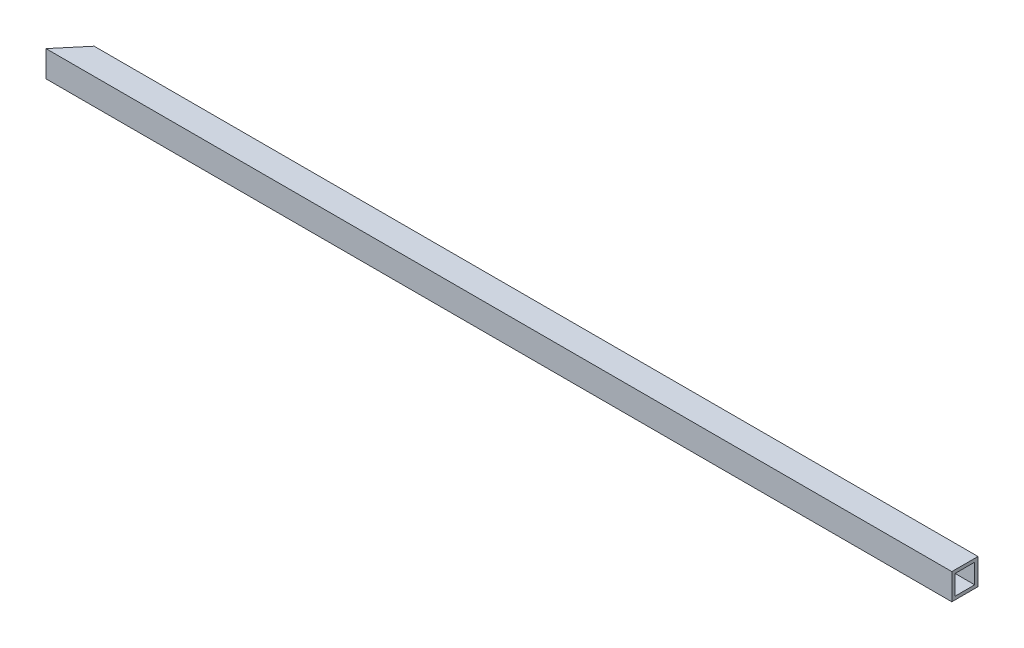
ISO-10303-21;
HEADER;
FILE_DESCRIPTION(('STEP AP214'),'2;1');
FILE_NAME('part.step','',(''),(''),'','','');
FILE_SCHEMA(('AUTOMOTIVE_DESIGN { 1 0 10303 214 1 1 1 1 }'));
ENDSEC;
DATA;
#1=APPLICATION_CONTEXT('core data for automotive mechanical design processes');
#2=APPLICATION_PROTOCOL_DEFINITION('international standard','automotive_design',2000,#1);
#3=PRODUCT_CONTEXT('',#1,'mechanical');
#4=PRODUCT('Part','Part','',(#3));
#5=PRODUCT_RELATED_PRODUCT_CATEGORY('part','',(#4));
#6=PRODUCT_DEFINITION_FORMATION('','',#4);
#7=PRODUCT_DEFINITION_CONTEXT('part definition',#1,'design');
#8=PRODUCT_DEFINITION('design','',#6,#7);
#9=PRODUCT_DEFINITION_SHAPE('','',#8);
#10=(LENGTH_UNIT() NAMED_UNIT(*) SI_UNIT(.MILLI.,.METRE.));
#11=(NAMED_UNIT(*) PLANE_ANGLE_UNIT() SI_UNIT($,.RADIAN.));
#12=(NAMED_UNIT(*) SI_UNIT($,.STERADIAN.) SOLID_ANGLE_UNIT());
#13=UNCERTAINTY_MEASURE_WITH_UNIT(LENGTH_MEASURE(1.E-05),#10,'distance_accuracy_value','');
#14=(GEOMETRIC_REPRESENTATION_CONTEXT(3) GLOBAL_UNCERTAINTY_ASSIGNED_CONTEXT((#13)) GLOBAL_UNIT_ASSIGNED_CONTEXT((#10,
#11,#12)) REPRESENTATION_CONTEXT('',''));
#15=CARTESIAN_POINT('',(0.,0.,0.));
#16=DIRECTION('',(0.,0.,1.));
#17=DIRECTION('',(1.,0.,0.));
#18=AXIS2_PLACEMENT_3D('',#15,#16,#17);
#19=CARTESIAN_POINT('',(254.,-6.35,6.35));
#20=DIRECTION('',(-1.,0.,0.));
#21=DIRECTION('',(0.,0.,1.));
#22=AXIS2_PLACEMENT_3D('',#19,#20,#21);
#23=PLANE('',#22);
#24=DIRECTION('',(0.,-1.,0.));
#25=VECTOR('',#24,1.);
#26=CARTESIAN_POINT('',(254.,6.35,6.35));
#27=LINE('',#26,#25);
#28=CARTESIAN_POINT('',(254.,6.35,6.35));
#29=VERTEX_POINT('',#28);
#30=CARTESIAN_POINT('',(254.,-6.35,6.35));
#31=VERTEX_POINT('',#30);
#32=EDGE_CURVE('E122',#29,#31,#27,.T.);
#33=ORIENTED_EDGE('',*,*,#32,.T.);
#34=DIRECTION('',(0.,0.,-1.));
#35=VECTOR('',#34,1.);
#36=CARTESIAN_POINT('',(254.,-6.35,-6.35));
#37=LINE('',#36,#35);
#38=CARTESIAN_POINT('',(254.,-6.35,-6.35));
#39=VERTEX_POINT('',#38);
#40=EDGE_CURVE('E136',#31,#39,#37,.T.);
#41=ORIENTED_EDGE('',*,*,#40,.T.);
#42=DIRECTION('',(0.,1.,0.));
#43=VECTOR('',#42,1.);
#44=CARTESIAN_POINT('',(254.,6.35,-6.35));
#45=LINE('',#44,#43);
#46=CARTESIAN_POINT('',(254.,6.35,-6.35));
#47=VERTEX_POINT('',#46);
#48=EDGE_CURVE('E126',#39,#47,#45,.T.);
#49=ORIENTED_EDGE('',*,*,#48,.T.);
#50=DIRECTION('',(0.,0.,1.));
#51=VECTOR('',#50,1.);
#52=CARTESIAN_POINT('',(254.,6.35,-6.35));
#53=LINE('',#52,#51);
#54=EDGE_CURVE('E123',#47,#29,#53,.T.);
#55=ORIENTED_EDGE('',*,*,#54,.T.);
#56=EDGE_LOOP('',(#33,#41,#49,#55));
#57=FACE_BOUND('',#56,.T.);
#58=DIRECTION('',(0.,1.,0.));
#59=VECTOR('',#58,1.);
#60=CARTESIAN_POINT('',(254.,4.7625,-4.7625));
#61=LINE('',#60,#59);
#62=CARTESIAN_POINT('',(254.,-4.7625,-4.7625));
#63=VERTEX_POINT('',#62);
#64=CARTESIAN_POINT('',(254.,4.7625,-4.7625));
#65=VERTEX_POINT('',#64);
#66=EDGE_CURVE('E108',#63,#65,#61,.T.);
#67=ORIENTED_EDGE('',*,*,#66,.F.);
#68=DIRECTION('',(0.,0.,-1.));
#69=VECTOR('',#68,1.);
#70=CARTESIAN_POINT('',(254.,-4.7625,-4.7625));
#71=LINE('',#70,#69);
#72=CARTESIAN_POINT('',(254.,-4.7625,4.7625));
#73=VERTEX_POINT('',#72);
#74=EDGE_CURVE('E152',#73,#63,#71,.T.);
#75=ORIENTED_EDGE('',*,*,#74,.F.);
#76=DIRECTION('',(0.,-1.,0.));
#77=VECTOR('',#76,1.);
#78=CARTESIAN_POINT('',(254.,4.7625,4.7625));
#79=LINE('',#78,#77);
#80=CARTESIAN_POINT('',(254.,4.7625,4.7625));
#81=VERTEX_POINT('',#80);
#82=EDGE_CURVE('E150',#81,#73,#79,.T.);
#83=ORIENTED_EDGE('',*,*,#82,.F.);
#84=DIRECTION('',(0.,0.,1.));
#85=VECTOR('',#84,1.);
#86=CARTESIAN_POINT('',(254.,4.7625,-4.7625));
#87=LINE('',#86,#85);
#88=EDGE_CURVE('E148',#65,#81,#87,.T.);
#89=ORIENTED_EDGE('',*,*,#88,.F.);
#90=EDGE_LOOP('',(#67,#75,#83,#89));
#91=FACE_BOUND('',#90,.T.);
#92=ADVANCED_FACE('F34',(#57,#91),#23,.F.);
#93=CARTESIAN_POINT('',(254.,6.35,6.35));
#94=DIRECTION('',(0.,0.,-1.));
#95=DIRECTION('',(0.,1.,0.));
#96=AXIS2_PLACEMENT_3D('',#93,#94,#95);
#97=PLANE('',#96);
#98=DIRECTION('',(-1.,0.,0.));
#99=VECTOR('',#98,1.);
#100=CARTESIAN_POINT('',(254.,6.35,6.35));
#101=LINE('',#100,#99);
#102=CARTESIAN_POINT('',(-185.42,6.35,6.35));
#103=VERTEX_POINT('',#102);
#104=EDGE_CURVE('E116',#29,#103,#101,.T.);
#105=ORIENTED_EDGE('',*,*,#104,.T.);
#106=DIRECTION('',(0.,-1.,0.));
#107=VECTOR('',#106,1.);
#108=CARTESIAN_POINT('',(-185.42,6.35,6.35));
#109=LINE('',#108,#107);
#110=CARTESIAN_POINT('',(-185.42,-6.35,6.35));
#111=VERTEX_POINT('',#110);
#112=EDGE_CURVE('E98',#103,#111,#109,.T.);
#113=ORIENTED_EDGE('',*,*,#112,.T.);
#114=DIRECTION('',(-1.,0.,0.));
#115=VECTOR('',#114,1.);
#116=CARTESIAN_POINT('',(254.,-6.35,6.35));
#117=LINE('',#116,#115);
#118=EDGE_CURVE('E11',#31,#111,#117,.T.);
#119=ORIENTED_EDGE('',*,*,#118,.F.);
#120=ORIENTED_EDGE('',*,*,#32,.F.);
#121=EDGE_LOOP('',(#105,#113,#119,#120));
#122=FACE_BOUND('',#121,.T.);
#123=ADVANCED_FACE('F36',(#122),#97,.F.);
#124=CARTESIAN_POINT('',(254.,-6.35,-6.35));
#125=DIRECTION('',(0.,1.,0.));
#126=DIRECTION('',(0.,0.,1.));
#127=AXIS2_PLACEMENT_3D('',#124,#125,#126);
#128=PLANE('',#127);
#129=ORIENTED_EDGE('',*,*,#118,.T.);
#130=DIRECTION('',(0.642787609686538,0.,-0.766044443118979));
#131=VECTOR('',#130,1.);
#132=CARTESIAN_POINT('',(-185.42,-6.35,6.35));
#133=LINE('',#132,#131);
#134=CARTESIAN_POINT('',(-174.763434684048,-6.35,-6.35000000000001));
#135=VERTEX_POINT('',#134);
#136=EDGE_CURVE('E104',#111,#135,#133,.T.);
#137=ORIENTED_EDGE('',*,*,#136,.T.);
#138=DIRECTION('',(-1.,0.,0.));
#139=VECTOR('',#138,1.);
#140=CARTESIAN_POINT('',(254.,-6.35,-6.35));
#141=LINE('',#140,#139);
#142=EDGE_CURVE('E42',#39,#135,#141,.T.);
#143=ORIENTED_EDGE('',*,*,#142,.F.);
#144=ORIENTED_EDGE('',*,*,#40,.F.);
#145=EDGE_LOOP('',(#129,#137,#143,#144));
#146=FACE_BOUND('',#145,.T.);
#147=ADVANCED_FACE('F135',(#146),#128,.F.);
#148=CARTESIAN_POINT('',(254.,6.35,-6.35));
#149=DIRECTION('',(0.,0.,1.));
#150=DIRECTION('',(0.,-1.,0.));
#151=AXIS2_PLACEMENT_3D('',#148,#149,#150);
#152=PLANE('',#151);
#153=ORIENTED_EDGE('',*,*,#142,.T.);
#154=DIRECTION('',(0.,1.,0.));
#155=VECTOR('',#154,1.);
#156=CARTESIAN_POINT('',(-174.763434684048,6.34999999999995,-6.35));
#157=LINE('',#156,#155);
#158=CARTESIAN_POINT('',(-174.763434684048,6.35,-6.34999999999998));
#159=VERTEX_POINT('',#158);
#160=EDGE_CURVE('E109',#135,#159,#157,.T.);
#161=ORIENTED_EDGE('',*,*,#160,.T.);
#162=DIRECTION('',(-1.,0.,0.));
#163=VECTOR('',#162,1.);
#164=CARTESIAN_POINT('',(254.,6.35,-6.35));
#165=LINE('',#164,#163);
#166=EDGE_CURVE('E119',#47,#159,#165,.T.);
#167=ORIENTED_EDGE('',*,*,#166,.F.);
#168=ORIENTED_EDGE('',*,*,#48,.F.);
#169=EDGE_LOOP('',(#153,#161,#167,#168));
#170=FACE_BOUND('',#169,.T.);
#171=ADVANCED_FACE('F133',(#170),#152,.F.);
#172=CARTESIAN_POINT('',(254.,6.35,-6.35));
#173=DIRECTION('',(0.,-1.,0.));
#174=DIRECTION('',(0.,0.,-1.));
#175=AXIS2_PLACEMENT_3D('',#172,#173,#174);
#176=PLANE('',#175);
#177=ORIENTED_EDGE('',*,*,#166,.T.);
#178=DIRECTION('',(0.642787609686538,0.,-0.766044443118979));
#179=VECTOR('',#178,1.);
#180=CARTESIAN_POINT('',(-185.42,6.35,6.35));
#181=LINE('',#180,#179);
#182=EDGE_CURVE('E101',#103,#159,#181,.T.);
#183=ORIENTED_EDGE('',*,*,#182,.F.);
#184=ORIENTED_EDGE('',*,*,#104,.F.);
#185=ORIENTED_EDGE('',*,*,#54,.F.);
#186=EDGE_LOOP('',(#177,#183,#184,#185));
#187=FACE_BOUND('',#186,.T.);
#188=ADVANCED_FACE('F114',(#187),#176,.F.);
#189=CARTESIAN_POINT('',(254.,4.7625,-4.7625));
#190=DIRECTION('',(0.,0.,1.));
#191=DIRECTION('',(1.,0.,0.));
#192=AXIS2_PLACEMENT_3D('',#189,#190,#191);
#193=PLANE('',#192);
#194=DIRECTION('',(0.,1.,0.));
#195=VECTOR('',#194,1.);
#196=CARTESIAN_POINT('',(-176.095505348542,4.7625,-4.7625));
#197=LINE('',#196,#195);
#198=CARTESIAN_POINT('',(-176.095505348542,-4.7625,-4.76250000000006));
#199=VERTEX_POINT('',#198);
#200=CARTESIAN_POINT('',(-176.095505348542,4.7625,-4.76250000000006));
#201=VERTEX_POINT('',#200);
#202=EDGE_CURVE('E144',#199,#201,#197,.T.);
#203=ORIENTED_EDGE('',*,*,#202,.F.);
#204=DIRECTION('',(-1.,0.,0.));
#205=VECTOR('',#204,1.);
#206=CARTESIAN_POINT('',(254.,-4.7625,-4.7625));
#207=LINE('',#206,#205);
#208=EDGE_CURVE('E154',#63,#199,#207,.T.);
#209=ORIENTED_EDGE('',*,*,#208,.F.);
#210=ORIENTED_EDGE('',*,*,#66,.T.);
#211=DIRECTION('',(-1.,0.,0.));
#212=VECTOR('',#211,1.);
#213=CARTESIAN_POINT('',(254.,4.7625,-4.7625));
#214=LINE('',#213,#212);
#215=EDGE_CURVE('E161',#65,#201,#214,.T.);
#216=ORIENTED_EDGE('',*,*,#215,.T.);
#217=EDGE_LOOP('',(#203,#209,#210,#216));
#218=FACE_BOUND('',#217,.T.);
#219=ADVANCED_FACE('F177',(#218),#193,.T.);
#220=CARTESIAN_POINT('',(254.,4.7625,-4.7625));
#221=DIRECTION('',(0.,-1.,0.));
#222=DIRECTION('',(0.,0.,-1.));
#223=AXIS2_PLACEMENT_3D('',#220,#221,#222);
#224=PLANE('',#223);
#225=DIRECTION('',(-0.642787609686538,0.,0.766044443118979));
#226=VECTOR('',#225,1.);
#227=CARTESIAN_POINT('',(1.60959696247204,4.7625,-216.543194101474));
#228=LINE('',#227,#226);
#229=CARTESIAN_POINT('',(-184.087929335506,4.7625,4.7625));
#230=VERTEX_POINT('',#229);
#231=EDGE_CURVE('E142',#201,#230,#228,.T.);
#232=ORIENTED_EDGE('',*,*,#231,.F.);
#233=ORIENTED_EDGE('',*,*,#215,.F.);
#234=ORIENTED_EDGE('',*,*,#88,.T.);
#235=DIRECTION('',(-1.,0.,0.));
#236=VECTOR('',#235,1.);
#237=CARTESIAN_POINT('',(254.,4.7625,4.7625));
#238=LINE('',#237,#236);
#239=EDGE_CURVE('E158',#81,#230,#238,.T.);
#240=ORIENTED_EDGE('',*,*,#239,.T.);
#241=EDGE_LOOP('',(#232,#233,#234,#240));
#242=FACE_BOUND('',#241,.T.);
#243=ADVANCED_FACE('F180',(#242),#224,.T.);
#244=CARTESIAN_POINT('',(254.,4.7625,4.7625));
#245=DIRECTION('',(0.,0.,-1.));
#246=DIRECTION('',(0.,1.,0.));
#247=AXIS2_PLACEMENT_3D('',#244,#245,#246);
#248=PLANE('',#247);
#249=DIRECTION('',(0.,-1.,0.));
#250=VECTOR('',#249,1.);
#251=CARTESIAN_POINT('',(-184.087929335506,4.76250000000003,4.7625));
#252=LINE('',#251,#250);
#253=CARTESIAN_POINT('',(-184.087929335506,-4.7625,4.76250000000002));
#254=VERTEX_POINT('',#253);
#255=EDGE_CURVE('E49',#230,#254,#252,.T.);
#256=ORIENTED_EDGE('',*,*,#255,.F.);
#257=ORIENTED_EDGE('',*,*,#239,.F.);
#258=ORIENTED_EDGE('',*,*,#82,.T.);
#259=DIRECTION('',(-1.,0.,0.));
#260=VECTOR('',#259,1.);
#261=CARTESIAN_POINT('',(254.,-4.7625,4.7625));
#262=LINE('',#261,#260);
#263=EDGE_CURVE('E56',#73,#254,#262,.T.);
#264=ORIENTED_EDGE('',*,*,#263,.T.);
#265=EDGE_LOOP('',(#256,#257,#258,#264));
#266=FACE_BOUND('',#265,.T.);
#267=ADVANCED_FACE('F183',(#266),#248,.T.);
#268=CARTESIAN_POINT('',(254.,-4.7625,-4.7625));
#269=DIRECTION('',(0.,1.,0.));
#270=DIRECTION('',(0.,0.,1.));
#271=AXIS2_PLACEMENT_3D('',#268,#269,#270);
#272=PLANE('',#271);
#273=DIRECTION('',(0.642787609686538,0.,-0.766044443118979));
#274=VECTOR('',#273,1.);
#275=CARTESIAN_POINT('',(1.60959696247204,-4.76250000000002,-216.543194101474));
#276=LINE('',#275,#274);
#277=EDGE_CURVE('E137',#254,#199,#276,.T.);
#278=ORIENTED_EDGE('',*,*,#277,.F.);
#279=ORIENTED_EDGE('',*,*,#263,.F.);
#280=ORIENTED_EDGE('',*,*,#74,.T.);
#281=ORIENTED_EDGE('',*,*,#208,.T.);
#282=EDGE_LOOP('',(#278,#279,#280,#281));
#283=FACE_BOUND('',#282,.T.);
#284=ADVANCED_FACE('F185',(#283),#272,.T.);
#285=CARTESIAN_POINT('',(-185.42,-6.35,6.35));
#286=DIRECTION('',(0.766044443118979,0.,0.642787609686538));
#287=DIRECTION('',(0.642787609686538,0.,-0.766044443118979));
#288=AXIS2_PLACEMENT_3D('',#285,#286,#287);
#289=PLANE('',#288);
#290=ORIENTED_EDGE('',*,*,#202,.T.);
#291=ORIENTED_EDGE('',*,*,#231,.T.);
#292=ORIENTED_EDGE('',*,*,#255,.T.);
#293=ORIENTED_EDGE('',*,*,#277,.T.);
#294=EDGE_LOOP('',(#290,#291,#292,#293));
#295=FACE_BOUND('',#294,.T.);
#296=ORIENTED_EDGE('',*,*,#136,.F.);
#297=ORIENTED_EDGE('',*,*,#112,.F.);
#298=ORIENTED_EDGE('',*,*,#182,.T.);
#299=ORIENTED_EDGE('',*,*,#160,.F.);
#300=EDGE_LOOP('',(#296,#297,#298,#299));
#301=FACE_BOUND('',#300,.T.);
#302=ADVANCED_FACE('F100',(#295,#301),#289,.F.);
#303=CLOSED_SHELL('',(#92,#123,#147,#171,#188,#219,#243,#267,#284,#302));
#304=MANIFOLD_SOLID_BREP('B2',#303);
#305=ADVANCED_BREP_SHAPE_REPRESENTATION('',(#18,#304),#14);
#306=SHAPE_DEFINITION_REPRESENTATION(#9,#305);
ENDSEC;
END-ISO-10303-21;
